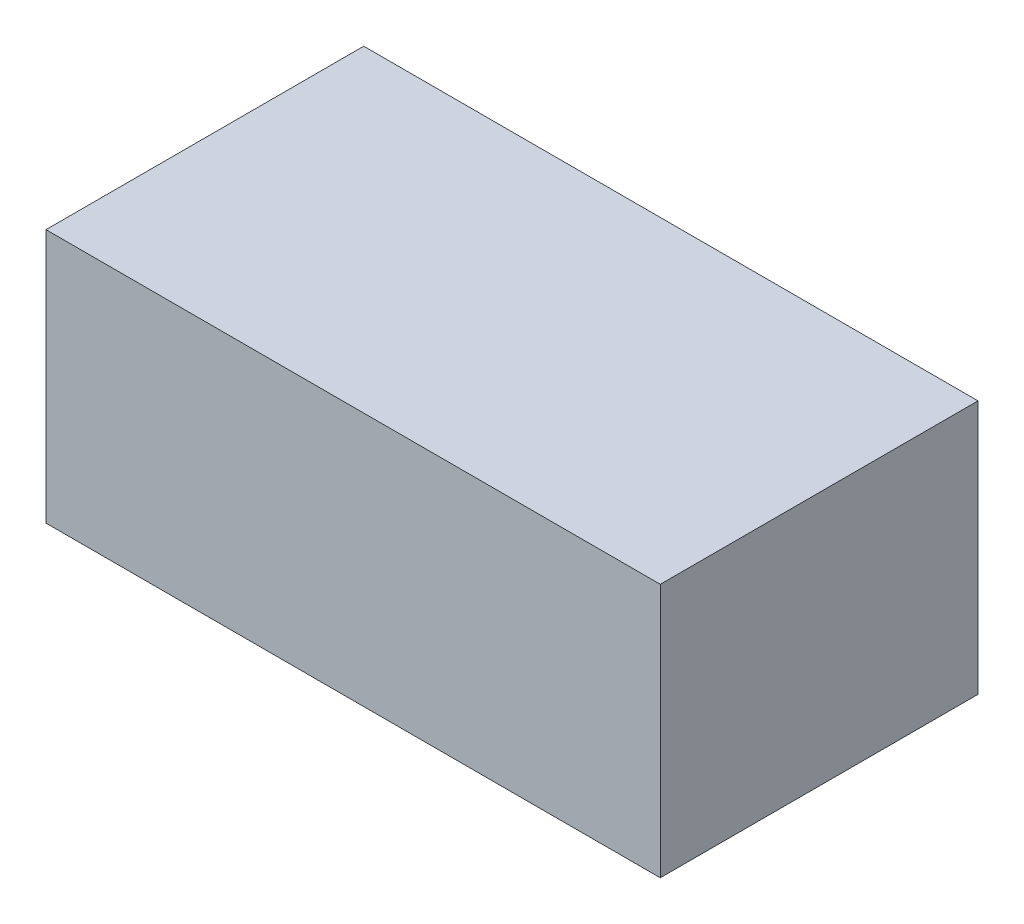
ISO-10303-21;
HEADER;
FILE_DESCRIPTION(('STEP AP214'),'2;1');
FILE_NAME('part.step','',(''),(''),'','','');
FILE_SCHEMA(('AUTOMOTIVE_DESIGN { 1 0 10303 214 1 1 1 1 }'));
ENDSEC;
DATA;
#1=APPLICATION_CONTEXT('core data for automotive mechanical design processes');
#2=APPLICATION_PROTOCOL_DEFINITION('international standard','automotive_design',2000,#1);
#3=PRODUCT_CONTEXT('',#1,'mechanical');
#4=PRODUCT('Part','Part','',(#3));
#5=PRODUCT_RELATED_PRODUCT_CATEGORY('part','',(#4));
#6=PRODUCT_DEFINITION_FORMATION('','',#4);
#7=PRODUCT_DEFINITION_CONTEXT('part definition',#1,'design');
#8=PRODUCT_DEFINITION('design','',#6,#7);
#9=PRODUCT_DEFINITION_SHAPE('','',#8);
#10=(LENGTH_UNIT() NAMED_UNIT(*) SI_UNIT(.MILLI.,.METRE.));
#11=(NAMED_UNIT(*) PLANE_ANGLE_UNIT() SI_UNIT($,.RADIAN.));
#12=(NAMED_UNIT(*) SI_UNIT($,.STERADIAN.) SOLID_ANGLE_UNIT());
#13=UNCERTAINTY_MEASURE_WITH_UNIT(LENGTH_MEASURE(1.E-05),#10,'distance_accuracy_value','');
#14=(GEOMETRIC_REPRESENTATION_CONTEXT(3) GLOBAL_UNCERTAINTY_ASSIGNED_CONTEXT((#13)) GLOBAL_UNIT_ASSIGNED_CONTEXT((#10,
#11,#12)) REPRESENTATION_CONTEXT('',''));
#15=CARTESIAN_POINT('',(0.,0.,0.));
#16=DIRECTION('',(0.,0.,1.));
#17=DIRECTION('',(1.,0.,0.));
#18=AXIS2_PLACEMENT_3D('',#15,#16,#17);
#19=CARTESIAN_POINT('',(29.,24.,15.));
#20=DIRECTION('',(-1.,0.,0.));
#21=DIRECTION('',(0.,0.,1.));
#22=AXIS2_PLACEMENT_3D('',#19,#20,#21);
#23=PLANE('',#22);
#24=DIRECTION('',(0.,0.,-1.));
#25=VECTOR('',#24,1.);
#26=CARTESIAN_POINT('',(29.,0.,15.));
#27=LINE('',#26,#25);
#28=CARTESIAN_POINT('',(29.,0.,15.));
#29=VERTEX_POINT('',#28);
#30=CARTESIAN_POINT('',(29.,0.,-15.));
#31=VERTEX_POINT('',#30);
#32=EDGE_CURVE('E96',#29,#31,#27,.T.);
#33=ORIENTED_EDGE('',*,*,#32,.T.);
#34=DIRECTION('',(0.,-1.,0.));
#35=VECTOR('',#34,1.);
#36=CARTESIAN_POINT('',(29.,24.,-15.));
#37=LINE('',#36,#35);
#38=CARTESIAN_POINT('',(29.,24.,-15.));
#39=VERTEX_POINT('',#38);
#40=EDGE_CURVE('E11',#39,#31,#37,.T.);
#41=ORIENTED_EDGE('',*,*,#40,.F.);
#42=DIRECTION('',(0.,0.,-1.));
#43=VECTOR('',#42,1.);
#44=CARTESIAN_POINT('',(29.,24.,15.));
#45=LINE('',#44,#43);
#46=CARTESIAN_POINT('',(29.,24.,15.));
#47=VERTEX_POINT('',#46);
#48=EDGE_CURVE('E84',#47,#39,#45,.T.);
#49=ORIENTED_EDGE('',*,*,#48,.F.);
#50=DIRECTION('',(0.,-1.,0.));
#51=VECTOR('',#50,1.);
#52=CARTESIAN_POINT('',(29.,24.,15.));
#53=LINE('',#52,#51);
#54=EDGE_CURVE('E92',#47,#29,#53,.T.);
#55=ORIENTED_EDGE('',*,*,#54,.T.);
#56=EDGE_LOOP('',(#33,#41,#49,#55));
#57=FACE_BOUND('',#56,.T.);
#58=ADVANCED_FACE('F33',(#57),#23,.F.);
#59=CARTESIAN_POINT('',(-29.,24.,-15.));
#60=DIRECTION('',(0.,0.,1.));
#61=DIRECTION('',(1.,0.,0.));
#62=AXIS2_PLACEMENT_3D('',#59,#60,#61);
#63=PLANE('',#62);
#64=DIRECTION('',(-1.,0.,0.));
#65=VECTOR('',#64,1.);
#66=CARTESIAN_POINT('',(-29.,0.,-15.));
#67=LINE('',#66,#65);
#68=CARTESIAN_POINT('',(-29.,0.,-15.));
#69=VERTEX_POINT('',#68);
#70=EDGE_CURVE('E88',#31,#69,#67,.T.);
#71=ORIENTED_EDGE('',*,*,#70,.T.);
#72=DIRECTION('',(0.,-1.,0.));
#73=VECTOR('',#72,1.);
#74=CARTESIAN_POINT('',(-29.,24.,-15.));
#75=LINE('',#74,#73);
#76=CARTESIAN_POINT('',(-29.,24.,-15.));
#77=VERTEX_POINT('',#76);
#78=EDGE_CURVE('E41',#77,#69,#75,.T.);
#79=ORIENTED_EDGE('',*,*,#78,.F.);
#80=DIRECTION('',(-1.,0.,0.));
#81=VECTOR('',#80,1.);
#82=CARTESIAN_POINT('',(-29.,24.,-15.));
#83=LINE('',#82,#81);
#84=EDGE_CURVE('E79',#39,#77,#83,.T.);
#85=ORIENTED_EDGE('',*,*,#84,.F.);
#86=ORIENTED_EDGE('',*,*,#40,.T.);
#87=EDGE_LOOP('',(#71,#79,#85,#86));
#88=FACE_BOUND('',#87,.T.);
#89=ADVANCED_FACE('F87',(#88),#63,.F.);
#90=CARTESIAN_POINT('',(-29.,24.,15.));
#91=DIRECTION('',(1.,0.,0.));
#92=DIRECTION('',(0.,0.,-1.));
#93=AXIS2_PLACEMENT_3D('',#90,#91,#92);
#94=PLANE('',#93);
#95=DIRECTION('',(0.,0.,1.));
#96=VECTOR('',#95,1.);
#97=CARTESIAN_POINT('',(-29.,0.,15.));
#98=LINE('',#97,#96);
#99=CARTESIAN_POINT('',(-29.,0.,15.));
#100=VERTEX_POINT('',#99);
#101=EDGE_CURVE('E66',#69,#100,#98,.T.);
#102=ORIENTED_EDGE('',*,*,#101,.T.);
#103=DIRECTION('',(0.,-1.,0.));
#104=VECTOR('',#103,1.);
#105=CARTESIAN_POINT('',(-29.,24.,15.));
#106=LINE('',#105,#104);
#107=CARTESIAN_POINT('',(-29.,24.,15.));
#108=VERTEX_POINT('',#107);
#109=EDGE_CURVE('E89',#108,#100,#106,.T.);
#110=ORIENTED_EDGE('',*,*,#109,.F.);
#111=DIRECTION('',(0.,0.,1.));
#112=VECTOR('',#111,1.);
#113=CARTESIAN_POINT('',(-29.,24.,15.));
#114=LINE('',#113,#112);
#115=EDGE_CURVE('E82',#77,#108,#114,.T.);
#116=ORIENTED_EDGE('',*,*,#115,.F.);
#117=ORIENTED_EDGE('',*,*,#78,.T.);
#118=EDGE_LOOP('',(#102,#110,#116,#117));
#119=FACE_BOUND('',#118,.T.);
#120=ADVANCED_FACE('F90',(#119),#94,.F.);
#121=CARTESIAN_POINT('',(-29.,24.,15.));
#122=DIRECTION('',(0.,0.,-1.));
#123=DIRECTION('',(-1.,0.,0.));
#124=AXIS2_PLACEMENT_3D('',#121,#122,#123);
#125=PLANE('',#124);
#126=DIRECTION('',(1.,0.,0.));
#127=VECTOR('',#126,1.);
#128=CARTESIAN_POINT('',(-29.,0.,15.));
#129=LINE('',#128,#127);
#130=EDGE_CURVE('E72',#100,#29,#129,.T.);
#131=ORIENTED_EDGE('',*,*,#130,.T.);
#132=ORIENTED_EDGE('',*,*,#54,.F.);
#133=DIRECTION('',(1.,0.,0.));
#134=VECTOR('',#133,1.);
#135=CARTESIAN_POINT('',(-29.,24.,15.));
#136=LINE('',#135,#134);
#137=EDGE_CURVE('E49',#108,#47,#136,.T.);
#138=ORIENTED_EDGE('',*,*,#137,.F.);
#139=ORIENTED_EDGE('',*,*,#109,.T.);
#140=EDGE_LOOP('',(#131,#132,#138,#139));
#141=FACE_BOUND('',#140,.T.);
#142=ADVANCED_FACE('F103',(#141),#125,.F.);
#143=CARTESIAN_POINT('',(0.,24.,0.));
#144=DIRECTION('',(0.,-1.,0.));
#145=DIRECTION('',(0.,0.,-1.));
#146=AXIS2_PLACEMENT_3D('',#143,#144,#145);
#147=PLANE('',#146);
#148=ORIENTED_EDGE('',*,*,#48,.T.);
#149=ORIENTED_EDGE('',*,*,#84,.T.);
#150=ORIENTED_EDGE('',*,*,#115,.T.);
#151=ORIENTED_EDGE('',*,*,#137,.T.);
#152=EDGE_LOOP('',(#148,#149,#150,#151));
#153=FACE_BOUND('',#152,.T.);
#154=ADVANCED_FACE('F80',(#153),#147,.F.);
#155=CARTESIAN_POINT('',(0.,0.,0.));
#156=DIRECTION('',(0.,-1.,0.));
#157=DIRECTION('',(0.,0.,-1.));
#158=AXIS2_PLACEMENT_3D('',#155,#156,#157);
#159=PLANE('',#158);
#160=ORIENTED_EDGE('',*,*,#32,.F.);
#161=ORIENTED_EDGE('',*,*,#130,.F.);
#162=ORIENTED_EDGE('',*,*,#101,.F.);
#163=ORIENTED_EDGE('',*,*,#70,.F.);
#164=EDGE_LOOP('',(#160,#161,#162,#163));
#165=FACE_BOUND('',#164,.T.);
#166=ADVANCED_FACE('F106',(#165),#159,.T.);
#167=CLOSED_SHELL('',(#58,#89,#120,#142,#154,#166));
#168=MANIFOLD_SOLID_BREP('B2',#167);
#169=ADVANCED_BREP_SHAPE_REPRESENTATION('',(#18,#168),#14);
#170=SHAPE_DEFINITION_REPRESENTATION(#9,#169);
ENDSEC;
END-ISO-10303-21;
